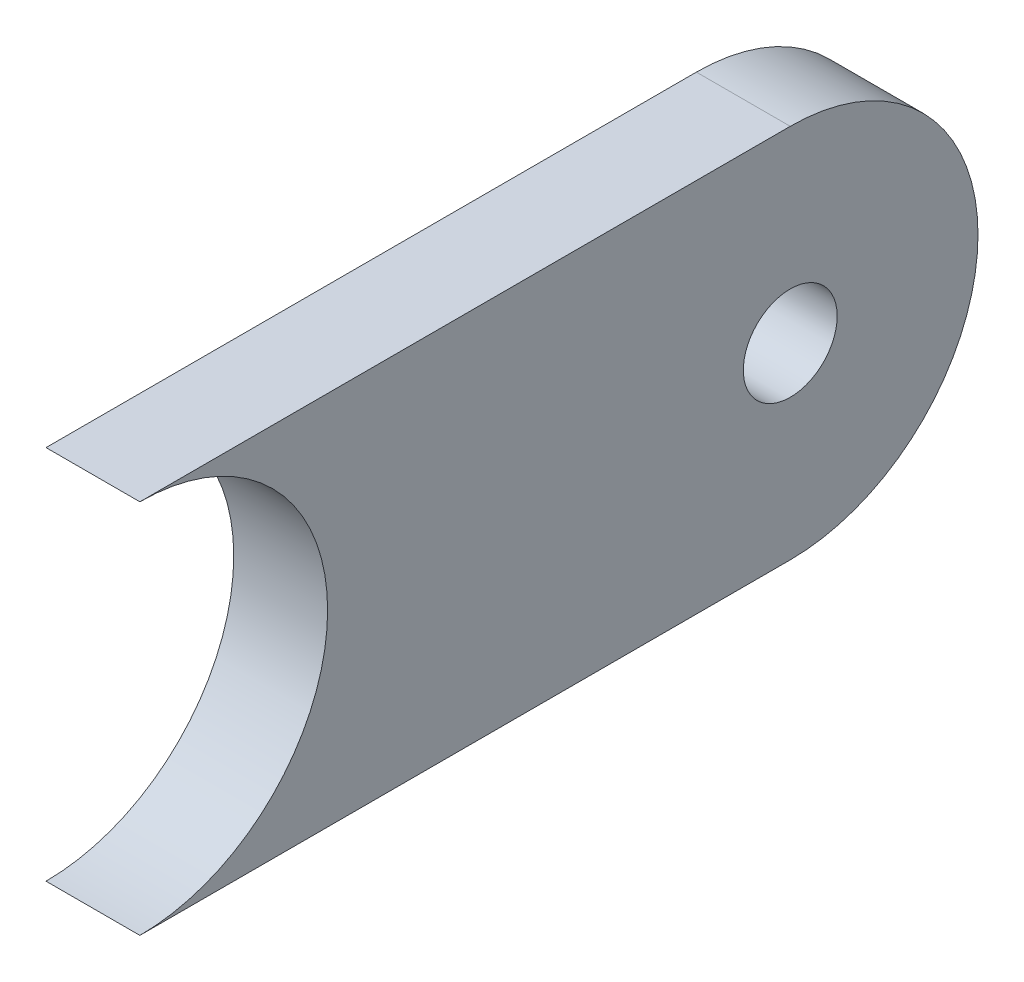
ISO-10303-21;
HEADER;
FILE_DESCRIPTION(('STEP AP214'),'2;1');
FILE_NAME('part.step','',(''),(''),'','','');
FILE_SCHEMA(('AUTOMOTIVE_DESIGN { 1 0 10303 214 1 1 1 1 }'));
ENDSEC;
DATA;
#1=APPLICATION_CONTEXT('core data for automotive mechanical design processes');
#2=APPLICATION_PROTOCOL_DEFINITION('international standard','automotive_design',2000,#1);
#3=PRODUCT_CONTEXT('',#1,'mechanical');
#4=PRODUCT('Part','Part','',(#3));
#5=PRODUCT_RELATED_PRODUCT_CATEGORY('part','',(#4));
#6=PRODUCT_DEFINITION_FORMATION('','',#4);
#7=PRODUCT_DEFINITION_CONTEXT('part definition',#1,'design');
#8=PRODUCT_DEFINITION('design','',#6,#7);
#9=PRODUCT_DEFINITION_SHAPE('','',#8);
#10=(LENGTH_UNIT() NAMED_UNIT(*) SI_UNIT(.MILLI.,.METRE.));
#11=(NAMED_UNIT(*) PLANE_ANGLE_UNIT() SI_UNIT($,.RADIAN.));
#12=(NAMED_UNIT(*) SI_UNIT($,.STERADIAN.) SOLID_ANGLE_UNIT());
#13=UNCERTAINTY_MEASURE_WITH_UNIT(LENGTH_MEASURE(1.E-05),#10,'distance_accuracy_value','');
#14=(GEOMETRIC_REPRESENTATION_CONTEXT(3) GLOBAL_UNCERTAINTY_ASSIGNED_CONTEXT((#13)) GLOBAL_UNIT_ASSIGNED_CONTEXT((#10,
#11,#12)) REPRESENTATION_CONTEXT('',''));
#15=CARTESIAN_POINT('',(0.,0.,0.));
#16=DIRECTION('',(0.,0.,1.));
#17=DIRECTION('',(1.,0.,0.));
#18=AXIS2_PLACEMENT_3D('',#15,#16,#17);
#19=CARTESIAN_POINT('',(5.,0.,34.64));
#20=DIRECTION('',(1.,0.,0.));
#21=DIRECTION('',(0.,0.,-1.));
#22=AXIS2_PLACEMENT_3D('',#19,#20,#21);
#23=PLANE('',#22);
#24=CARTESIAN_POINT('',(5.,0.,34.64));
#25=DIRECTION('',(-1.,0.,0.));
#26=DIRECTION('',(0.,0.,-1.));
#27=AXIS2_PLACEMENT_3D('',#24,#25,#26);
#28=CIRCLE('',#27,10.);
#29=CARTESIAN_POINT('',(5.,10.,34.64));
#30=VERTEX_POINT('',#29);
#31=CARTESIAN_POINT('',(5.,-10.,34.64));
#32=VERTEX_POINT('',#31);
#33=EDGE_CURVE('E92',#30,#32,#28,.T.);
#34=ORIENTED_EDGE('',*,*,#33,.T.);
#35=DIRECTION('',(0.,0.,-1.));
#36=VECTOR('',#35,1.);
#37=CARTESIAN_POINT('',(5.,-10.,34.64));
#38=LINE('',#37,#36);
#39=CARTESIAN_POINT('',(5.,-10.,0.));
#40=VERTEX_POINT('',#39);
#41=EDGE_CURVE('E87',#32,#40,#38,.T.);
#42=ORIENTED_EDGE('',*,*,#41,.T.);
#43=CARTESIAN_POINT('',(5.,0.,0.));
#44=DIRECTION('',(1.,0.,0.));
#45=DIRECTION('',(0.,0.,-1.));
#46=AXIS2_PLACEMENT_3D('',#43,#44,#45);
#47=CIRCLE('',#46,10.);
#48=CARTESIAN_POINT('',(5.,10.,0.));
#49=VERTEX_POINT('',#48);
#50=EDGE_CURVE('E90',#40,#49,#47,.T.);
#51=ORIENTED_EDGE('',*,*,#50,.T.);
#52=DIRECTION('',(0.,0.,1.));
#53=VECTOR('',#52,1.);
#54=CARTESIAN_POINT('',(5.,10.,34.64));
#55=LINE('',#54,#53);
#56=EDGE_CURVE('E57',#49,#30,#55,.T.);
#57=ORIENTED_EDGE('',*,*,#56,.T.);
#58=EDGE_LOOP('',(#34,#42,#51,#57));
#59=FACE_BOUND('',#58,.T.);
#60=CARTESIAN_POINT('',(5.,0.,0.));
#61=DIRECTION('',(1.,0.,0.));
#62=DIRECTION('',(0.,0.,-1.));
#63=AXIS2_PLACEMENT_3D('',#60,#61,#62);
#64=CIRCLE('',#63,2.5);
#65=CARTESIAN_POINT('',(5.,0.,-2.5));
#66=VERTEX_POINT('',#65);
#67=EDGE_CURVE('E112',#66,#66,#64,.T.);
#68=ORIENTED_EDGE('',*,*,#67,.F.);
#69=EDGE_LOOP('',(#68));
#70=FACE_BOUND('',#69,.T.);
#71=ADVANCED_FACE('F39',(#59,#70),#23,.T.);
#72=CARTESIAN_POINT('',(0.,0.,34.64));
#73=DIRECTION('',(1.,0.,0.));
#74=DIRECTION('',(0.,0.,-1.));
#75=AXIS2_PLACEMENT_3D('',#72,#73,#74);
#76=PLANE('',#75);
#77=CARTESIAN_POINT('',(0.,0.,34.64));
#78=DIRECTION('',(-1.,0.,0.));
#79=DIRECTION('',(0.,0.,-1.));
#80=AXIS2_PLACEMENT_3D('',#77,#78,#79);
#81=CIRCLE('',#80,10.);
#82=CARTESIAN_POINT('',(0.,10.,34.64));
#83=VERTEX_POINT('',#82);
#84=CARTESIAN_POINT('',(0.,-10.,34.64));
#85=VERTEX_POINT('',#84);
#86=EDGE_CURVE('E108',#83,#85,#81,.T.);
#87=ORIENTED_EDGE('',*,*,#86,.F.);
#88=DIRECTION('',(0.,0.,1.));
#89=VECTOR('',#88,1.);
#90=CARTESIAN_POINT('',(0.,10.,34.64));
#91=LINE('',#90,#89);
#92=CARTESIAN_POINT('',(0.,10.,0.));
#93=VERTEX_POINT('',#92);
#94=EDGE_CURVE('E80',#93,#83,#91,.T.);
#95=ORIENTED_EDGE('',*,*,#94,.F.);
#96=CARTESIAN_POINT('',(0.,0.,0.));
#97=DIRECTION('',(1.,0.,0.));
#98=DIRECTION('',(0.,0.,-1.));
#99=AXIS2_PLACEMENT_3D('',#96,#97,#98);
#100=CIRCLE('',#99,10.);
#101=CARTESIAN_POINT('',(0.,-10.,0.));
#102=VERTEX_POINT('',#101);
#103=EDGE_CURVE('E74',#102,#93,#100,.T.);
#104=ORIENTED_EDGE('',*,*,#103,.F.);
#105=DIRECTION('',(0.,0.,-1.));
#106=VECTOR('',#105,1.);
#107=CARTESIAN_POINT('',(0.,-10.,34.64));
#108=LINE('',#107,#106);
#109=EDGE_CURVE('E97',#85,#102,#108,.T.);
#110=ORIENTED_EDGE('',*,*,#109,.F.);
#111=EDGE_LOOP('',(#87,#95,#104,#110));
#112=FACE_BOUND('',#111,.T.);
#113=CARTESIAN_POINT('',(0.,0.,0.));
#114=DIRECTION('',(1.,0.,0.));
#115=DIRECTION('',(0.,0.,-1.));
#116=AXIS2_PLACEMENT_3D('',#113,#114,#115);
#117=CIRCLE('',#116,2.5);
#118=CARTESIAN_POINT('',(0.,0.,-2.5));
#119=VERTEX_POINT('',#118);
#120=EDGE_CURVE('E130',#119,#119,#117,.T.);
#121=ORIENTED_EDGE('',*,*,#120,.T.);
#122=EDGE_LOOP('',(#121));
#123=FACE_BOUND('',#122,.T.);
#124=ADVANCED_FACE('F125',(#112,#123),#76,.F.);
#125=CARTESIAN_POINT('',(5.,0.,34.64));
#126=DIRECTION('',(-1.,0.,0.));
#127=DIRECTION('',(0.,0.,1.));
#128=AXIS2_PLACEMENT_3D('',#125,#126,#127);
#129=CYLINDRICAL_SURFACE('',#128,10.);
#130=ORIENTED_EDGE('',*,*,#86,.T.);
#131=DIRECTION('',(-1.,0.,0.));
#132=VECTOR('',#131,1.);
#133=CARTESIAN_POINT('',(5.,-10.,34.64));
#134=LINE('',#133,#132);
#135=EDGE_CURVE('E11',#32,#85,#134,.T.);
#136=ORIENTED_EDGE('',*,*,#135,.F.);
#137=ORIENTED_EDGE('',*,*,#33,.F.);
#138=DIRECTION('',(-1.,0.,0.));
#139=VECTOR('',#138,1.);
#140=CARTESIAN_POINT('',(5.,10.,34.64));
#141=LINE('',#140,#139);
#142=EDGE_CURVE('E104',#30,#83,#141,.T.);
#143=ORIENTED_EDGE('',*,*,#142,.T.);
#144=EDGE_LOOP('',(#130,#136,#137,#143));
#145=FACE_BOUND('',#144,.T.);
#146=ADVANCED_FACE('F41',(#145),#129,.F.);
#147=CARTESIAN_POINT('',(5.,-10.,34.64));
#148=DIRECTION('',(0.,1.,0.));
#149=DIRECTION('',(0.,0.,1.));
#150=AXIS2_PLACEMENT_3D('',#147,#148,#149);
#151=PLANE('',#150);
#152=ORIENTED_EDGE('',*,*,#109,.T.);
#153=DIRECTION('',(-1.,0.,0.));
#154=VECTOR('',#153,1.);
#155=CARTESIAN_POINT('',(5.,-10.,0.));
#156=LINE('',#155,#154);
#157=EDGE_CURVE('E49',#40,#102,#156,.T.);
#158=ORIENTED_EDGE('',*,*,#157,.F.);
#159=ORIENTED_EDGE('',*,*,#41,.F.);
#160=ORIENTED_EDGE('',*,*,#135,.T.);
#161=EDGE_LOOP('',(#152,#158,#159,#160));
#162=FACE_BOUND('',#161,.T.);
#163=ADVANCED_FACE('F96',(#162),#151,.F.);
#164=CARTESIAN_POINT('',(5.,0.,0.));
#165=DIRECTION('',(-1.,0.,0.));
#166=DIRECTION('',(0.,0.,1.));
#167=AXIS2_PLACEMENT_3D('',#164,#165,#166);
#168=CYLINDRICAL_SURFACE('',#167,10.);
#169=ORIENTED_EDGE('',*,*,#103,.T.);
#170=DIRECTION('',(-1.,0.,0.));
#171=VECTOR('',#170,1.);
#172=CARTESIAN_POINT('',(5.,10.,0.));
#173=LINE('',#172,#171);
#174=EDGE_CURVE('E99',#49,#93,#173,.T.);
#175=ORIENTED_EDGE('',*,*,#174,.F.);
#176=ORIENTED_EDGE('',*,*,#50,.F.);
#177=ORIENTED_EDGE('',*,*,#157,.T.);
#178=EDGE_LOOP('',(#169,#175,#176,#177));
#179=FACE_BOUND('',#178,.T.);
#180=ADVANCED_FACE('F100',(#179),#168,.T.);
#181=CARTESIAN_POINT('',(5.,10.,34.64));
#182=DIRECTION('',(0.,-1.,0.));
#183=DIRECTION('',(0.,0.,-1.));
#184=AXIS2_PLACEMENT_3D('',#181,#182,#183);
#185=PLANE('',#184);
#186=ORIENTED_EDGE('',*,*,#94,.T.);
#187=ORIENTED_EDGE('',*,*,#142,.F.);
#188=ORIENTED_EDGE('',*,*,#56,.F.);
#189=ORIENTED_EDGE('',*,*,#174,.T.);
#190=EDGE_LOOP('',(#186,#187,#188,#189));
#191=FACE_BOUND('',#190,.T.);
#192=ADVANCED_FACE('F122',(#191),#185,.F.);
#193=CARTESIAN_POINT('',(5.,0.,0.));
#194=DIRECTION('',(-1.,0.,0.));
#195=DIRECTION('',(0.,0.,1.));
#196=AXIS2_PLACEMENT_3D('',#193,#194,#195);
#197=CYLINDRICAL_SURFACE('',#196,2.5);
#198=ORIENTED_EDGE('',*,*,#67,.T.);
#199=EDGE_LOOP('',(#198));
#200=FACE_BOUND('',#199,.T.);
#201=ORIENTED_EDGE('',*,*,#120,.F.);
#202=EDGE_LOOP('',(#201));
#203=FACE_BOUND('',#202,.T.);
#204=ADVANCED_FACE('F138',(#200,#203),#197,.F.);
#205=CLOSED_SHELL('',(#71,#124,#146,#163,#180,#192,#204));
#206=MANIFOLD_SOLID_BREP('B2',#205);
#207=ADVANCED_BREP_SHAPE_REPRESENTATION('',(#18,#206),#14);
#208=SHAPE_DEFINITION_REPRESENTATION(#9,#207);
ENDSEC;
END-ISO-10303-21;
